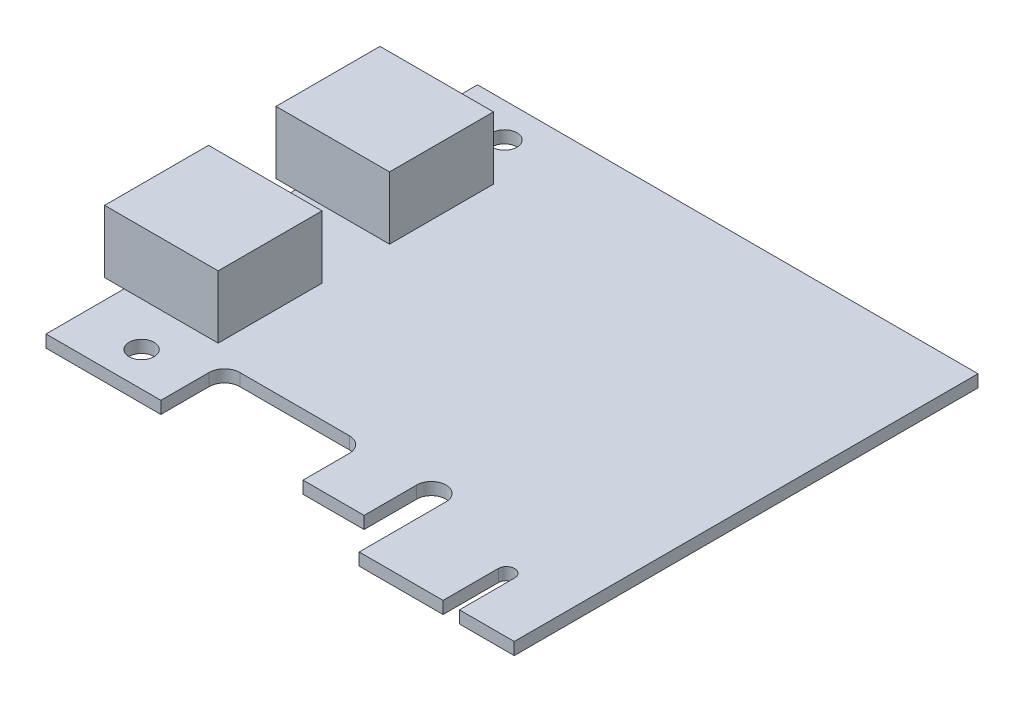
ISO-10303-21;
HEADER;
FILE_DESCRIPTION(('STEP AP214'),'2;1');
FILE_NAME('part.step','',(''),(''),'','','');
FILE_SCHEMA(('AUTOMOTIVE_DESIGN { 1 0 10303 214 1 1 1 1 }'));
ENDSEC;
DATA;
#1=APPLICATION_CONTEXT('core data for automotive mechanical design processes');
#2=APPLICATION_PROTOCOL_DEFINITION('international standard','automotive_design',2000,#1);
#3=PRODUCT_CONTEXT('',#1,'mechanical');
#4=PRODUCT('Part','Part','',(#3));
#5=PRODUCT_RELATED_PRODUCT_CATEGORY('part','',(#4));
#6=PRODUCT_DEFINITION_FORMATION('','',#4);
#7=PRODUCT_DEFINITION_CONTEXT('part definition',#1,'design');
#8=PRODUCT_DEFINITION('design','',#6,#7);
#9=PRODUCT_DEFINITION_SHAPE('','',#8);
#10=(LENGTH_UNIT() NAMED_UNIT(*) SI_UNIT(.MILLI.,.METRE.));
#11=(NAMED_UNIT(*) PLANE_ANGLE_UNIT() SI_UNIT($,.RADIAN.));
#12=(NAMED_UNIT(*) SI_UNIT($,.STERADIAN.) SOLID_ANGLE_UNIT());
#13=UNCERTAINTY_MEASURE_WITH_UNIT(LENGTH_MEASURE(1.E-05),#10,'distance_accuracy_value','');
#14=(GEOMETRIC_REPRESENTATION_CONTEXT(3) GLOBAL_UNCERTAINTY_ASSIGNED_CONTEXT((#13)) GLOBAL_UNIT_ASSIGNED_CONTEXT((#10,
#11,#12)) REPRESENTATION_CONTEXT('',''));
#15=CARTESIAN_POINT('',(0.,0.,0.));
#16=DIRECTION('',(0.,0.,1.));
#17=DIRECTION('',(1.,0.,0.));
#18=AXIS2_PLACEMENT_3D('',#15,#16,#17);
#19=CARTESIAN_POINT('',(-15.6276,1.6,19.7292));
#20=DIRECTION('',(0.,1.,0.));
#21=DIRECTION('',(0.,0.,1.));
#22=AXIS2_PLACEMENT_3D('',#19,#20,#21);
#23=PLANE('',#22);
#24=CARTESIAN_POINT('',(-24.6126,1.6,-25.7302));
#25=DIRECTION('',(0.,1.,0.));
#26=DIRECTION('',(0.,0.,1.));
#27=AXIS2_PLACEMENT_3D('',#24,#25,#26);
#28=CIRCLE('',#27,1.63195);
#29=CARTESIAN_POINT('',(-24.6126,1.6,-24.09825));
#30=VERTEX_POINT('',#29);
#31=EDGE_CURVE('E281',#30,#30,#28,.T.);
#32=ORIENTED_EDGE('',*,*,#31,.F.);
#33=EDGE_LOOP('',(#32));
#34=FACE_BOUND('',#33,.T.);
#35=CARTESIAN_POINT('',(-24.6126,1.6,21.5392));
#36=DIRECTION('',(0.,1.,0.));
#37=DIRECTION('',(0.,0.,1.));
#38=AXIS2_PLACEMENT_3D('',#35,#36,#37);
#39=CIRCLE('',#38,1.63195);
#40=CARTESIAN_POINT('',(-24.6126,1.6,23.17115));
#41=VERTEX_POINT('',#40);
#42=EDGE_CURVE('E287',#41,#41,#39,.T.);
#43=ORIENTED_EDGE('',*,*,#42,.F.);
#44=EDGE_LOOP('',(#43));
#45=FACE_BOUND('',#44,.T.);
#46=DIRECTION('',(0.,0.,1.));
#47=VECTOR('',#46,1.);
#48=CARTESIAN_POINT('',(-32.5882,1.6,26.0096));
#49=LINE('',#48,#47);
#50=CARTESIAN_POINT('',(-32.5882,1.6,-6.48969999999998));
#51=VERTEX_POINT('',#50);
#52=CARTESIAN_POINT('',(-32.5882,1.6,2.29870000000001));
#53=VERTEX_POINT('',#52);
#54=EDGE_CURVE('E448',#51,#53,#49,.T.);
#55=ORIENTED_EDGE('',*,*,#54,.T.);
#56=DIRECTION('',(-1.,0.,0.));
#57=VECTOR('',#56,1.);
#58=CARTESIAN_POINT('',(-35.1282,1.6,2.29870000000001));
#59=LINE('',#58,#57);
#60=CARTESIAN_POINT('',(-20.3454,1.6,2.29870000000001));
#61=VERTEX_POINT('',#60);
#62=EDGE_CURVE('E776',#61,#53,#59,.T.);
#63=ORIENTED_EDGE('',*,*,#62,.F.);
#64=DIRECTION('',(0.,0.,-1.));
#65=VECTOR('',#64,1.);
#66=CARTESIAN_POINT('',(-20.3454,1.6,15.8369));
#67=LINE('',#66,#65);
#68=CARTESIAN_POINT('',(-20.3454,1.6,15.8369));
#69=VERTEX_POINT('',#68);
#70=EDGE_CURVE('E243',#69,#61,#67,.T.);
#71=ORIENTED_EDGE('',*,*,#70,.F.);
#72=DIRECTION('',(-1.,0.,0.));
#73=VECTOR('',#72,1.);
#74=CARTESIAN_POINT('',(-15.6276,1.6,15.8369));
#75=LINE('',#74,#73);
#76=CARTESIAN_POINT('',(-32.5882,1.6,15.8369));
#77=VERTEX_POINT('',#76);
#78=EDGE_CURVE('E11',#69,#77,#75,.T.);
#79=ORIENTED_EDGE('',*,*,#78,.T.);
#80=CARTESIAN_POINT('',(-32.5882,1.6,26.0096));
#81=VERTEX_POINT('',#80);
#82=EDGE_CURVE('E300',#77,#81,#49,.T.);
#83=ORIENTED_EDGE('',*,*,#82,.T.);
#84=DIRECTION('',(1.,0.,0.));
#85=VECTOR('',#84,1.);
#86=CARTESIAN_POINT('',(-17.6276,1.6,26.0096));
#87=LINE('',#86,#85);
#88=CARTESIAN_POINT('',(-17.6276,1.6,26.0096));
#89=VERTEX_POINT('',#88);
#90=EDGE_CURVE('E303',#81,#89,#87,.T.);
#91=ORIENTED_EDGE('',*,*,#90,.T.);
#92=DIRECTION('',(0.,0.,-1.));
#93=VECTOR('',#92,1.);
#94=CARTESIAN_POINT('',(-17.6276,1.6,19.7292));
#95=LINE('',#94,#93);
#96=CARTESIAN_POINT('',(-17.6276,1.6,19.7292));
#97=VERTEX_POINT('',#96);
#98=EDGE_CURVE('E306',#89,#97,#95,.T.);
#99=ORIENTED_EDGE('',*,*,#98,.T.);
#100=CARTESIAN_POINT('',(-15.6276,1.6,19.7292));
#101=DIRECTION('',(0.,-1.,0.));
#102=DIRECTION('',(0.,0.,1.));
#103=AXIS2_PLACEMENT_3D('',#100,#101,#102);
#104=CIRCLE('',#103,2.);
#105=CARTESIAN_POINT('',(-15.6276,1.6,17.7292));
#106=VERTEX_POINT('',#105);
#107=EDGE_CURVE('E308',#97,#106,#104,.T.);
#108=ORIENTED_EDGE('',*,*,#107,.T.);
#109=DIRECTION('',(1.,0.,0.));
#110=VECTOR('',#109,1.);
#111=CARTESIAN_POINT('',(-1.365,1.6,17.7292));
#112=LINE('',#111,#110);
#113=CARTESIAN_POINT('',(-1.365,1.6,17.7292));
#114=VERTEX_POINT('',#113);
#115=EDGE_CURVE('E310',#106,#114,#112,.T.);
#116=ORIENTED_EDGE('',*,*,#115,.T.);
#117=CARTESIAN_POINT('',(-1.365,1.6,19.7292));
#118=DIRECTION('',(0.,-1.,0.));
#119=DIRECTION('',(0.,0.,-1.));
#120=AXIS2_PLACEMENT_3D('',#117,#118,#119);
#121=CIRCLE('',#120,2.);
#122=CARTESIAN_POINT('',(0.634999999999999,1.6,19.7292));
#123=VERTEX_POINT('',#122);
#124=EDGE_CURVE('E312',#114,#123,#121,.T.);
#125=ORIENTED_EDGE('',*,*,#124,.T.);
#126=DIRECTION('',(0.,0.,1.));
#127=VECTOR('',#126,1.);
#128=CARTESIAN_POINT('',(0.635,1.6,25.7556));
#129=LINE('',#128,#127);
#130=CARTESIAN_POINT('',(0.635,1.6,25.7556));
#131=VERTEX_POINT('',#130);
#132=EDGE_CURVE('E314',#123,#131,#129,.T.);
#133=ORIENTED_EDGE('',*,*,#132,.T.);
#134=DIRECTION('',(1.,0.,0.));
#135=VECTOR('',#134,1.);
#136=CARTESIAN_POINT('',(8.5852,1.6,25.7556));
#137=LINE('',#136,#135);
#138=CARTESIAN_POINT('',(8.5852,1.6,25.7556));
#139=VERTEX_POINT('',#138);
#140=EDGE_CURVE('E316',#131,#139,#137,.T.);
#141=ORIENTED_EDGE('',*,*,#140,.T.);
#142=DIRECTION('',(0.,0.,-1.));
#143=VECTOR('',#142,1.);
#144=CARTESIAN_POINT('',(8.5852,1.6,18.8976));
#145=LINE('',#144,#143);
#146=CARTESIAN_POINT('',(8.5852,1.6,18.8976));
#147=VERTEX_POINT('',#146);
#148=EDGE_CURVE('E318',#139,#147,#145,.T.);
#149=ORIENTED_EDGE('',*,*,#148,.T.);
#150=CARTESIAN_POINT('',(10.4902,1.6,18.8976));
#151=DIRECTION('',(0.,-1.,0.));
#152=DIRECTION('',(0.,0.,1.));
#153=AXIS2_PLACEMENT_3D('',#150,#151,#152);
#154=CIRCLE('',#153,1.905);
#155=CARTESIAN_POINT('',(12.3952,1.6,18.8976));
#156=VERTEX_POINT('',#155);
#157=EDGE_CURVE('E320',#147,#156,#154,.T.);
#158=ORIENTED_EDGE('',*,*,#157,.T.);
#159=DIRECTION('',(0.,0.,1.));
#160=VECTOR('',#159,1.);
#161=CARTESIAN_POINT('',(12.3952,1.6,30.2006));
#162=LINE('',#161,#160);
#163=CARTESIAN_POINT('',(12.3952,1.6,30.2006));
#164=VERTEX_POINT('',#163);
#165=EDGE_CURVE('E322',#156,#164,#162,.T.);
#166=ORIENTED_EDGE('',*,*,#165,.T.);
#167=DIRECTION('',(1.,0.,0.));
#168=VECTOR('',#167,1.);
#169=CARTESIAN_POINT('',(12.3952,1.6,30.2006));
#170=LINE('',#169,#168);
#171=CARTESIAN_POINT('',(23.3172,1.6,30.2006));
#172=VERTEX_POINT('',#171);
#173=EDGE_CURVE('E324',#164,#172,#170,.T.);
#174=ORIENTED_EDGE('',*,*,#173,.T.);
#175=DIRECTION('',(0.,0.,-1.));
#176=VECTOR('',#175,1.);
#177=CARTESIAN_POINT('',(23.3172,1.6,30.2006));
#178=LINE('',#177,#176);
#179=CARTESIAN_POINT('',(23.3172,1.6,23.0124));
#180=VERTEX_POINT('',#179);
#181=EDGE_CURVE('E326',#172,#180,#178,.T.);
#182=ORIENTED_EDGE('',*,*,#181,.T.);
#183=CARTESIAN_POINT('',(24.384,1.6,23.0124));
#184=DIRECTION('',(0.,-1.,0.));
#185=DIRECTION('',(0.,0.,-1.));
#186=AXIS2_PLACEMENT_3D('',#183,#184,#185);
#187=CIRCLE('',#186,1.0668);
#188=CARTESIAN_POINT('',(25.4508,1.6,23.0124));
#189=VERTEX_POINT('',#188);
#190=EDGE_CURVE('E328',#180,#189,#187,.T.);
#191=ORIENTED_EDGE('',*,*,#190,.T.);
#192=DIRECTION('',(0.,0.,1.));
#193=VECTOR('',#192,1.);
#194=CARTESIAN_POINT('',(25.4508,1.6,23.0124));
#195=LINE('',#194,#193);
#196=CARTESIAN_POINT('',(25.4508,1.6,30.2006));
#197=VERTEX_POINT('',#196);
#198=EDGE_CURVE('E330',#189,#197,#195,.T.);
#199=ORIENTED_EDGE('',*,*,#198,.T.);
#200=DIRECTION('',(1.,0.,0.));
#201=VECTOR('',#200,1.);
#202=CARTESIAN_POINT('',(25.4508,1.6,30.2006));
#203=LINE('',#202,#201);
#204=CARTESIAN_POINT('',(32.5882,1.6,30.2006));
#205=VERTEX_POINT('',#204);
#206=EDGE_CURVE('E332',#197,#205,#203,.T.);
#207=ORIENTED_EDGE('',*,*,#206,.T.);
#208=DIRECTION('',(0.,0.,-1.));
#209=VECTOR('',#208,1.);
#210=CARTESIAN_POINT('',(32.5882,1.6,30.2006));
#211=LINE('',#210,#209);
#212=CARTESIAN_POINT('',(32.5882,1.6,-30.2006));
#213=VERTEX_POINT('',#212);
#214=EDGE_CURVE('E294',#205,#213,#211,.T.);
#215=ORIENTED_EDGE('',*,*,#214,.T.);
#216=DIRECTION('',(-1.,0.,0.));
#217=VECTOR('',#216,1.);
#218=CARTESIAN_POINT('',(-32.5882,1.6,-30.2006));
#219=LINE('',#218,#217);
#220=CARTESIAN_POINT('',(-32.5882,1.6,-30.2006));
#221=VERTEX_POINT('',#220);
#222=EDGE_CURVE('E297',#213,#221,#219,.T.);
#223=ORIENTED_EDGE('',*,*,#222,.T.);
#224=CARTESIAN_POINT('',(-32.5882,1.6,-20.0279));
#225=VERTEX_POINT('',#224);
#226=EDGE_CURVE('E301',#221,#225,#49,.T.);
#227=ORIENTED_EDGE('',*,*,#226,.T.);
#228=DIRECTION('',(-1.,0.,0.));
#229=VECTOR('',#228,1.);
#230=CARTESIAN_POINT('',(-35.1282,1.6,-20.0279));
#231=LINE('',#230,#229);
#232=CARTESIAN_POINT('',(-20.3454,1.6,-20.0279));
#233=VERTEX_POINT('',#232);
#234=EDGE_CURVE('E263',#233,#225,#231,.T.);
#235=ORIENTED_EDGE('',*,*,#234,.F.);
#236=DIRECTION('',(0.,0.,-1.));
#237=VECTOR('',#236,1.);
#238=CARTESIAN_POINT('',(-20.3454,1.6,-6.48969999999999));
#239=LINE('',#238,#237);
#240=CARTESIAN_POINT('',(-20.3454,1.6,-6.48969999999999));
#241=VERTEX_POINT('',#240);
#242=EDGE_CURVE('E57',#241,#233,#239,.T.);
#243=ORIENTED_EDGE('',*,*,#242,.F.);
#244=DIRECTION('',(1.,0.,0.));
#245=VECTOR('',#244,1.);
#246=CARTESIAN_POINT('',(-35.1282,1.6,-6.48969999999999));
#247=LINE('',#246,#245);
#248=EDGE_CURVE('E42',#51,#241,#247,.T.);
#249=ORIENTED_EDGE('',*,*,#248,.F.);
#250=EDGE_LOOP('',(#55,#63,#71,#79,#83,#91,#99,#108,#116,#125,#133,#141,#149,#158,#166,#174,
#182,#191,#199,#207,#215,#223,#227,#235,#243,#249));
#251=FACE_BOUND('',#250,.T.);
#252=ADVANCED_FACE('F34',(#34,#45,#251),#23,.T.);
#253=CARTESIAN_POINT('',(32.5882,1.6,30.2006));
#254=DIRECTION('',(-1.,0.,0.));
#255=DIRECTION('',(0.,0.,1.));
#256=AXIS2_PLACEMENT_3D('',#253,#254,#255);
#257=PLANE('',#256);
#258=DIRECTION('',(0.,0.,-1.));
#259=VECTOR('',#258,1.);
#260=CARTESIAN_POINT('',(32.5882,0.,30.2006));
#261=LINE('',#260,#259);
#262=CARTESIAN_POINT('',(32.5882,0.,30.2006));
#263=VERTEX_POINT('',#262);
#264=CARTESIAN_POINT('',(32.5882,0.,-30.2006));
#265=VERTEX_POINT('',#264);
#266=EDGE_CURVE('E293',#263,#265,#261,.T.);
#267=ORIENTED_EDGE('',*,*,#266,.T.);
#268=DIRECTION('',(0.,-1.,0.));
#269=VECTOR('',#268,1.);
#270=CARTESIAN_POINT('',(32.5882,1.6,-30.2006));
#271=LINE('',#270,#269);
#272=EDGE_CURVE('E419',#213,#265,#271,.T.);
#273=ORIENTED_EDGE('',*,*,#272,.F.);
#274=ORIENTED_EDGE('',*,*,#214,.F.);
#275=DIRECTION('',(0.,-1.,0.));
#276=VECTOR('',#275,1.);
#277=CARTESIAN_POINT('',(32.5882,1.6,30.2006));
#278=LINE('',#277,#276);
#279=EDGE_CURVE('E334',#205,#263,#278,.T.);
#280=ORIENTED_EDGE('',*,*,#279,.T.);
#281=EDGE_LOOP('',(#267,#273,#274,#280));
#282=FACE_BOUND('',#281,.T.);
#283=ADVANCED_FACE('F36',(#282),#257,.F.);
#284=CARTESIAN_POINT('',(-32.5882,1.6,-30.2006));
#285=DIRECTION('',(0.,0.,1.));
#286=DIRECTION('',(1.,0.,0.));
#287=AXIS2_PLACEMENT_3D('',#284,#285,#286);
#288=PLANE('',#287);
#289=DIRECTION('',(-1.,0.,0.));
#290=VECTOR('',#289,1.);
#291=CARTESIAN_POINT('',(-32.5882,0.,-30.2006));
#292=LINE('',#291,#290);
#293=CARTESIAN_POINT('',(-32.5882,0.,-30.2006));
#294=VERTEX_POINT('',#293);
#295=EDGE_CURVE('E337',#265,#294,#292,.T.);
#296=ORIENTED_EDGE('',*,*,#295,.T.);
#297=DIRECTION('',(0.,-1.,0.));
#298=VECTOR('',#297,1.);
#299=CARTESIAN_POINT('',(-32.5882,1.6,-30.2006));
#300=LINE('',#299,#298);
#301=EDGE_CURVE('E417',#221,#294,#300,.T.);
#302=ORIENTED_EDGE('',*,*,#301,.F.);
#303=ORIENTED_EDGE('',*,*,#222,.F.);
#304=ORIENTED_EDGE('',*,*,#272,.T.);
#305=EDGE_LOOP('',(#296,#302,#303,#304));
#306=FACE_BOUND('',#305,.T.);
#307=ADVANCED_FACE('F537',(#306),#288,.F.);
#308=CARTESIAN_POINT('',(-32.5882,1.6,26.0096));
#309=DIRECTION('',(1.,0.,0.));
#310=DIRECTION('',(0.,0.,-1.));
#311=AXIS2_PLACEMENT_3D('',#308,#309,#310);
#312=PLANE('',#311);
#313=DIRECTION('',(0.,0.,1.));
#314=VECTOR('',#313,1.);
#315=CARTESIAN_POINT('',(-32.5882,0.,26.0096));
#316=LINE('',#315,#314);
#317=CARTESIAN_POINT('',(-32.5882,0.,26.0096));
#318=VERTEX_POINT('',#317);
#319=EDGE_CURVE('E339',#294,#318,#316,.T.);
#320=ORIENTED_EDGE('',*,*,#319,.T.);
#321=DIRECTION('',(0.,-1.,0.));
#322=VECTOR('',#321,1.);
#323=CARTESIAN_POINT('',(-32.5882,1.6,26.0096));
#324=LINE('',#323,#322);
#325=EDGE_CURVE('E414',#81,#318,#324,.T.);
#326=ORIENTED_EDGE('',*,*,#325,.F.);
#327=ORIENTED_EDGE('',*,*,#82,.F.);
#328=EDGE_CURVE('E449',#53,#77,#49,.T.);
#329=ORIENTED_EDGE('',*,*,#328,.F.);
#330=ORIENTED_EDGE('',*,*,#54,.F.);
#331=EDGE_CURVE('E304',#225,#51,#49,.T.);
#332=ORIENTED_EDGE('',*,*,#331,.F.);
#333=ORIENTED_EDGE('',*,*,#226,.F.);
#334=ORIENTED_EDGE('',*,*,#301,.T.);
#335=EDGE_LOOP('',(#320,#326,#327,#329,#330,#332,#333,#334));
#336=FACE_BOUND('',#335,.T.);
#337=ADVANCED_FACE('F456',(#336),#312,.F.);
#338=CARTESIAN_POINT('',(-17.6276,1.6,26.0096));
#339=DIRECTION('',(0.,0.,-1.));
#340=DIRECTION('',(-1.,0.,0.));
#341=AXIS2_PLACEMENT_3D('',#338,#339,#340);
#342=PLANE('',#341);
#343=DIRECTION('',(1.,0.,0.));
#344=VECTOR('',#343,1.);
#345=CARTESIAN_POINT('',(-17.6276,0.,26.0096));
#346=LINE('',#345,#344);
#347=CARTESIAN_POINT('',(-17.6276,0.,26.0096));
#348=VERTEX_POINT('',#347);
#349=EDGE_CURVE('E341',#318,#348,#346,.T.);
#350=ORIENTED_EDGE('',*,*,#349,.T.);
#351=DIRECTION('',(0.,-1.,0.));
#352=VECTOR('',#351,1.);
#353=CARTESIAN_POINT('',(-17.6276,1.6,26.0096));
#354=LINE('',#353,#352);
#355=EDGE_CURVE('E411',#89,#348,#354,.T.);
#356=ORIENTED_EDGE('',*,*,#355,.F.);
#357=ORIENTED_EDGE('',*,*,#90,.F.);
#358=ORIENTED_EDGE('',*,*,#325,.T.);
#359=EDGE_LOOP('',(#350,#356,#357,#358));
#360=FACE_BOUND('',#359,.T.);
#361=ADVANCED_FACE('F460',(#360),#342,.F.);
#362=CARTESIAN_POINT('',(-17.6276,1.6,19.7292));
#363=DIRECTION('',(-1.,0.,0.));
#364=DIRECTION('',(0.,0.,1.));
#365=AXIS2_PLACEMENT_3D('',#362,#363,#364);
#366=PLANE('',#365);
#367=DIRECTION('',(0.,0.,-1.));
#368=VECTOR('',#367,1.);
#369=CARTESIAN_POINT('',(-17.6276,0.,19.7292));
#370=LINE('',#369,#368);
#371=CARTESIAN_POINT('',(-17.6276,0.,19.7292));
#372=VERTEX_POINT('',#371);
#373=EDGE_CURVE('E343',#348,#372,#370,.T.);
#374=ORIENTED_EDGE('',*,*,#373,.T.);
#375=DIRECTION('',(0.,-1.,0.));
#376=VECTOR('',#375,1.);
#377=CARTESIAN_POINT('',(-17.6276,1.6,19.7292));
#378=LINE('',#377,#376);
#379=EDGE_CURVE('E408',#97,#372,#378,.T.);
#380=ORIENTED_EDGE('',*,*,#379,.F.);
#381=ORIENTED_EDGE('',*,*,#98,.F.);
#382=ORIENTED_EDGE('',*,*,#355,.T.);
#383=EDGE_LOOP('',(#374,#380,#381,#382));
#384=FACE_BOUND('',#383,.T.);
#385=ADVANCED_FACE('F465',(#384),#366,.F.);
#386=CARTESIAN_POINT('',(-15.6276,1.6,19.7292));
#387=DIRECTION('',(0.,-1.,0.));
#388=DIRECTION('',(0.,0.,-1.));
#389=AXIS2_PLACEMENT_3D('',#386,#387,#388);
#390=CYLINDRICAL_SURFACE('',#389,2.);
#391=CARTESIAN_POINT('',(-15.6276,0.,19.7292));
#392=DIRECTION('',(0.,-1.,0.));
#393=DIRECTION('',(0.,0.,1.));
#394=AXIS2_PLACEMENT_3D('',#391,#392,#393);
#395=CIRCLE('',#394,2.);
#396=CARTESIAN_POINT('',(-15.6276,0.,17.7292));
#397=VERTEX_POINT('',#396);
#398=EDGE_CURVE('E345',#372,#397,#395,.T.);
#399=ORIENTED_EDGE('',*,*,#398,.T.);
#400=DIRECTION('',(0.,-1.,0.));
#401=VECTOR('',#400,1.);
#402=CARTESIAN_POINT('',(-15.6276,1.6,17.7292));
#403=LINE('',#402,#401);
#404=EDGE_CURVE('E405',#106,#397,#403,.T.);
#405=ORIENTED_EDGE('',*,*,#404,.F.);
#406=ORIENTED_EDGE('',*,*,#107,.F.);
#407=ORIENTED_EDGE('',*,*,#379,.T.);
#408=EDGE_LOOP('',(#399,#405,#406,#407));
#409=FACE_BOUND('',#408,.T.);
#410=ADVANCED_FACE('F471',(#409),#390,.F.);
#411=CARTESIAN_POINT('',(-1.365,1.6,17.7292));
#412=DIRECTION('',(0.,0.,-1.));
#413=DIRECTION('',(-1.,0.,0.));
#414=AXIS2_PLACEMENT_3D('',#411,#412,#413);
#415=PLANE('',#414);
#416=DIRECTION('',(1.,0.,0.));
#417=VECTOR('',#416,1.);
#418=CARTESIAN_POINT('',(-1.365,0.,17.7292));
#419=LINE('',#418,#417);
#420=CARTESIAN_POINT('',(-1.365,0.,17.7292));
#421=VERTEX_POINT('',#420);
#422=EDGE_CURVE('E347',#397,#421,#419,.T.);
#423=ORIENTED_EDGE('',*,*,#422,.T.);
#424=DIRECTION('',(0.,-1.,0.));
#425=VECTOR('',#424,1.);
#426=CARTESIAN_POINT('',(-1.365,1.6,17.7292));
#427=LINE('',#426,#425);
#428=EDGE_CURVE('E402',#114,#421,#427,.T.);
#429=ORIENTED_EDGE('',*,*,#428,.F.);
#430=ORIENTED_EDGE('',*,*,#115,.F.);
#431=ORIENTED_EDGE('',*,*,#404,.T.);
#432=EDGE_LOOP('',(#423,#429,#430,#431));
#433=FACE_BOUND('',#432,.T.);
#434=ADVANCED_FACE('F475',(#433),#415,.F.);
#435=CARTESIAN_POINT('',(-1.365,1.6,19.7292));
#436=DIRECTION('',(0.,-1.,0.));
#437=DIRECTION('',(0.,0.,-1.));
#438=AXIS2_PLACEMENT_3D('',#435,#436,#437);
#439=CYLINDRICAL_SURFACE('',#438,2.);
#440=CARTESIAN_POINT('',(-1.365,0.,19.7292));
#441=DIRECTION('',(0.,-1.,0.));
#442=DIRECTION('',(0.,0.,-1.));
#443=AXIS2_PLACEMENT_3D('',#440,#441,#442);
#444=CIRCLE('',#443,2.);
#445=CARTESIAN_POINT('',(0.634999999999999,0.,19.7292));
#446=VERTEX_POINT('',#445);
#447=EDGE_CURVE('E349',#421,#446,#444,.T.);
#448=ORIENTED_EDGE('',*,*,#447,.T.);
#449=DIRECTION('',(0.,-1.,0.));
#450=VECTOR('',#449,1.);
#451=CARTESIAN_POINT('',(0.634999999999999,1.6,19.7292));
#452=LINE('',#451,#450);
#453=EDGE_CURVE('E399',#123,#446,#452,.T.);
#454=ORIENTED_EDGE('',*,*,#453,.F.);
#455=ORIENTED_EDGE('',*,*,#124,.F.);
#456=ORIENTED_EDGE('',*,*,#428,.T.);
#457=EDGE_LOOP('',(#448,#454,#455,#456));
#458=FACE_BOUND('',#457,.T.);
#459=ADVANCED_FACE('F480',(#458),#439,.F.);
#460=CARTESIAN_POINT('',(0.635,1.6,25.7556));
#461=DIRECTION('',(1.,0.,0.));
#462=DIRECTION('',(0.,0.,-1.));
#463=AXIS2_PLACEMENT_3D('',#460,#461,#462);
#464=PLANE('',#463);
#465=DIRECTION('',(0.,0.,1.));
#466=VECTOR('',#465,1.);
#467=CARTESIAN_POINT('',(0.635,0.,25.7556));
#468=LINE('',#467,#466);
#469=CARTESIAN_POINT('',(0.635,0.,25.7556));
#470=VERTEX_POINT('',#469);
#471=EDGE_CURVE('E351',#446,#470,#468,.T.);
#472=ORIENTED_EDGE('',*,*,#471,.T.);
#473=DIRECTION('',(0.,-1.,0.));
#474=VECTOR('',#473,1.);
#475=CARTESIAN_POINT('',(0.635,1.6,25.7556));
#476=LINE('',#475,#474);
#477=EDGE_CURVE('E396',#131,#470,#476,.T.);
#478=ORIENTED_EDGE('',*,*,#477,.F.);
#479=ORIENTED_EDGE('',*,*,#132,.F.);
#480=ORIENTED_EDGE('',*,*,#453,.T.);
#481=EDGE_LOOP('',(#472,#478,#479,#480));
#482=FACE_BOUND('',#481,.T.);
#483=ADVANCED_FACE('F486',(#482),#464,.F.);
#484=CARTESIAN_POINT('',(8.5852,1.6,25.7556));
#485=DIRECTION('',(0.,0.,-1.));
#486=DIRECTION('',(-1.,0.,0.));
#487=AXIS2_PLACEMENT_3D('',#484,#485,#486);
#488=PLANE('',#487);
#489=DIRECTION('',(1.,0.,0.));
#490=VECTOR('',#489,1.);
#491=CARTESIAN_POINT('',(8.5852,0.,25.7556));
#492=LINE('',#491,#490);
#493=CARTESIAN_POINT('',(8.5852,0.,25.7556));
#494=VERTEX_POINT('',#493);
#495=EDGE_CURVE('E353',#470,#494,#492,.T.);
#496=ORIENTED_EDGE('',*,*,#495,.T.);
#497=DIRECTION('',(0.,-1.,0.));
#498=VECTOR('',#497,1.);
#499=CARTESIAN_POINT('',(8.5852,1.6,25.7556));
#500=LINE('',#499,#498);
#501=EDGE_CURVE('E393',#139,#494,#500,.T.);
#502=ORIENTED_EDGE('',*,*,#501,.F.);
#503=ORIENTED_EDGE('',*,*,#140,.F.);
#504=ORIENTED_EDGE('',*,*,#477,.T.);
#505=EDGE_LOOP('',(#496,#502,#503,#504));
#506=FACE_BOUND('',#505,.T.);
#507=ADVANCED_FACE('F490',(#506),#488,.F.);
#508=CARTESIAN_POINT('',(8.5852,1.6,18.8976));
#509=DIRECTION('',(-1.,0.,0.));
#510=DIRECTION('',(0.,0.,1.));
#511=AXIS2_PLACEMENT_3D('',#508,#509,#510);
#512=PLANE('',#511);
#513=DIRECTION('',(0.,0.,-1.));
#514=VECTOR('',#513,1.);
#515=CARTESIAN_POINT('',(8.5852,0.,18.8976));
#516=LINE('',#515,#514);
#517=CARTESIAN_POINT('',(8.5852,0.,18.8976));
#518=VERTEX_POINT('',#517);
#519=EDGE_CURVE('E355',#494,#518,#516,.T.);
#520=ORIENTED_EDGE('',*,*,#519,.T.);
#521=DIRECTION('',(0.,-1.,0.));
#522=VECTOR('',#521,1.);
#523=CARTESIAN_POINT('',(8.5852,1.6,18.8976));
#524=LINE('',#523,#522);
#525=EDGE_CURVE('E390',#147,#518,#524,.T.);
#526=ORIENTED_EDGE('',*,*,#525,.F.);
#527=ORIENTED_EDGE('',*,*,#148,.F.);
#528=ORIENTED_EDGE('',*,*,#501,.T.);
#529=EDGE_LOOP('',(#520,#526,#527,#528));
#530=FACE_BOUND('',#529,.T.);
#531=ADVANCED_FACE('F495',(#530),#512,.F.);
#532=CARTESIAN_POINT('',(10.4902,1.6,18.8976));
#533=DIRECTION('',(0.,-1.,0.));
#534=DIRECTION('',(0.,0.,-1.));
#535=AXIS2_PLACEMENT_3D('',#532,#533,#534);
#536=CYLINDRICAL_SURFACE('',#535,1.905);
#537=CARTESIAN_POINT('',(10.4902,0.,18.8976));
#538=DIRECTION('',(0.,-1.,0.));
#539=DIRECTION('',(0.,0.,1.));
#540=AXIS2_PLACEMENT_3D('',#537,#538,#539);
#541=CIRCLE('',#540,1.905);
#542=CARTESIAN_POINT('',(12.3952,0.,18.8976));
#543=VERTEX_POINT('',#542);
#544=EDGE_CURVE('E357',#518,#543,#541,.T.);
#545=ORIENTED_EDGE('',*,*,#544,.T.);
#546=DIRECTION('',(0.,-1.,0.));
#547=VECTOR('',#546,1.);
#548=CARTESIAN_POINT('',(12.3952,1.6,18.8976));
#549=LINE('',#548,#547);
#550=EDGE_CURVE('E387',#156,#543,#549,.T.);
#551=ORIENTED_EDGE('',*,*,#550,.F.);
#552=ORIENTED_EDGE('',*,*,#157,.F.);
#553=ORIENTED_EDGE('',*,*,#525,.T.);
#554=EDGE_LOOP('',(#545,#551,#552,#553));
#555=FACE_BOUND('',#554,.T.);
#556=ADVANCED_FACE('F501',(#555),#536,.F.);
#557=CARTESIAN_POINT('',(12.3952,1.6,30.2006));
#558=DIRECTION('',(1.,0.,0.));
#559=DIRECTION('',(0.,0.,-1.));
#560=AXIS2_PLACEMENT_3D('',#557,#558,#559);
#561=PLANE('',#560);
#562=DIRECTION('',(0.,0.,1.));
#563=VECTOR('',#562,1.);
#564=CARTESIAN_POINT('',(12.3952,0.,30.2006));
#565=LINE('',#564,#563);
#566=CARTESIAN_POINT('',(12.3952,0.,30.2006));
#567=VERTEX_POINT('',#566);
#568=EDGE_CURVE('E359',#543,#567,#565,.T.);
#569=ORIENTED_EDGE('',*,*,#568,.T.);
#570=DIRECTION('',(0.,-1.,0.));
#571=VECTOR('',#570,1.);
#572=CARTESIAN_POINT('',(12.3952,1.6,30.2006));
#573=LINE('',#572,#571);
#574=EDGE_CURVE('E384',#164,#567,#573,.T.);
#575=ORIENTED_EDGE('',*,*,#574,.F.);
#576=ORIENTED_EDGE('',*,*,#165,.F.);
#577=ORIENTED_EDGE('',*,*,#550,.T.);
#578=EDGE_LOOP('',(#569,#575,#576,#577));
#579=FACE_BOUND('',#578,.T.);
#580=ADVANCED_FACE('F505',(#579),#561,.F.);
#581=CARTESIAN_POINT('',(12.3952,1.6,30.2006));
#582=DIRECTION('',(0.,0.,-1.));
#583=DIRECTION('',(-1.,0.,0.));
#584=AXIS2_PLACEMENT_3D('',#581,#582,#583);
#585=PLANE('',#584);
#586=DIRECTION('',(1.,0.,0.));
#587=VECTOR('',#586,1.);
#588=CARTESIAN_POINT('',(12.3952,0.,30.2006));
#589=LINE('',#588,#587);
#590=CARTESIAN_POINT('',(23.3172,0.,30.2006));
#591=VERTEX_POINT('',#590);
#592=EDGE_CURVE('E361',#567,#591,#589,.T.);
#593=ORIENTED_EDGE('',*,*,#592,.T.);
#594=DIRECTION('',(0.,-1.,0.));
#595=VECTOR('',#594,1.);
#596=CARTESIAN_POINT('',(23.3172,1.6,30.2006));
#597=LINE('',#596,#595);
#598=EDGE_CURVE('E381',#172,#591,#597,.T.);
#599=ORIENTED_EDGE('',*,*,#598,.F.);
#600=ORIENTED_EDGE('',*,*,#173,.F.);
#601=ORIENTED_EDGE('',*,*,#574,.T.);
#602=EDGE_LOOP('',(#593,#599,#600,#601));
#603=FACE_BOUND('',#602,.T.);
#604=ADVANCED_FACE('F510',(#603),#585,.F.);
#605=CARTESIAN_POINT('',(23.3172,1.6,30.2006));
#606=DIRECTION('',(-1.,0.,0.));
#607=DIRECTION('',(0.,0.,1.));
#608=AXIS2_PLACEMENT_3D('',#605,#606,#607);
#609=PLANE('',#608);
#610=DIRECTION('',(0.,0.,-1.));
#611=VECTOR('',#610,1.);
#612=CARTESIAN_POINT('',(23.3172,0.,30.2006));
#613=LINE('',#612,#611);
#614=CARTESIAN_POINT('',(23.3172,0.,23.0124));
#615=VERTEX_POINT('',#614);
#616=EDGE_CURVE('E363',#591,#615,#613,.T.);
#617=ORIENTED_EDGE('',*,*,#616,.T.);
#618=DIRECTION('',(0.,-1.,0.));
#619=VECTOR('',#618,1.);
#620=CARTESIAN_POINT('',(23.3172,1.6,23.0124));
#621=LINE('',#620,#619);
#622=EDGE_CURVE('E378',#180,#615,#621,.T.);
#623=ORIENTED_EDGE('',*,*,#622,.F.);
#624=ORIENTED_EDGE('',*,*,#181,.F.);
#625=ORIENTED_EDGE('',*,*,#598,.T.);
#626=EDGE_LOOP('',(#617,#623,#624,#625));
#627=FACE_BOUND('',#626,.T.);
#628=ADVANCED_FACE('F516',(#627),#609,.F.);
#629=CARTESIAN_POINT('',(24.384,1.6,23.0124));
#630=DIRECTION('',(0.,-1.,0.));
#631=DIRECTION('',(0.,0.,-1.));
#632=AXIS2_PLACEMENT_3D('',#629,#630,#631);
#633=CYLINDRICAL_SURFACE('',#632,1.0668);
#634=CARTESIAN_POINT('',(24.384,0.,23.0124));
#635=DIRECTION('',(0.,-1.,0.));
#636=DIRECTION('',(0.,0.,-1.));
#637=AXIS2_PLACEMENT_3D('',#634,#635,#636);
#638=CIRCLE('',#637,1.0668);
#639=CARTESIAN_POINT('',(25.4508,0.,23.0124));
#640=VERTEX_POINT('',#639);
#641=EDGE_CURVE('E365',#615,#640,#638,.T.);
#642=ORIENTED_EDGE('',*,*,#641,.T.);
#643=DIRECTION('',(0.,-1.,0.));
#644=VECTOR('',#643,1.);
#645=CARTESIAN_POINT('',(25.4508,1.6,23.0124));
#646=LINE('',#645,#644);
#647=EDGE_CURVE('E375',#189,#640,#646,.T.);
#648=ORIENTED_EDGE('',*,*,#647,.F.);
#649=ORIENTED_EDGE('',*,*,#190,.F.);
#650=ORIENTED_EDGE('',*,*,#622,.T.);
#651=EDGE_LOOP('',(#642,#648,#649,#650));
#652=FACE_BOUND('',#651,.T.);
#653=ADVANCED_FACE('F520',(#652),#633,.F.);
#654=CARTESIAN_POINT('',(25.4508,1.6,23.0124));
#655=DIRECTION('',(1.,0.,0.));
#656=DIRECTION('',(0.,0.,-1.));
#657=AXIS2_PLACEMENT_3D('',#654,#655,#656);
#658=PLANE('',#657);
#659=DIRECTION('',(0.,0.,1.));
#660=VECTOR('',#659,1.);
#661=CARTESIAN_POINT('',(25.4508,0.,23.0124));
#662=LINE('',#661,#660);
#663=CARTESIAN_POINT('',(25.4508,0.,30.2006));
#664=VERTEX_POINT('',#663);
#665=EDGE_CURVE('E367',#640,#664,#662,.T.);
#666=ORIENTED_EDGE('',*,*,#665,.T.);
#667=DIRECTION('',(0.,-1.,0.));
#668=VECTOR('',#667,1.);
#669=CARTESIAN_POINT('',(25.4508,1.6,30.2006));
#670=LINE('',#669,#668);
#671=EDGE_CURVE('E372',#197,#664,#670,.T.);
#672=ORIENTED_EDGE('',*,*,#671,.F.);
#673=ORIENTED_EDGE('',*,*,#198,.F.);
#674=ORIENTED_EDGE('',*,*,#647,.T.);
#675=EDGE_LOOP('',(#666,#672,#673,#674));
#676=FACE_BOUND('',#675,.T.);
#677=ADVANCED_FACE('F525',(#676),#658,.F.);
#678=CARTESIAN_POINT('',(25.4508,1.6,30.2006));
#679=DIRECTION('',(0.,0.,-1.));
#680=DIRECTION('',(-1.,0.,0.));
#681=AXIS2_PLACEMENT_3D('',#678,#679,#680);
#682=PLANE('',#681);
#683=DIRECTION('',(1.,0.,0.));
#684=VECTOR('',#683,1.);
#685=CARTESIAN_POINT('',(25.4508,0.,30.2006));
#686=LINE('',#685,#684);
#687=EDGE_CURVE('E298',#664,#263,#686,.T.);
#688=ORIENTED_EDGE('',*,*,#687,.T.);
#689=ORIENTED_EDGE('',*,*,#279,.F.);
#690=ORIENTED_EDGE('',*,*,#206,.F.);
#691=ORIENTED_EDGE('',*,*,#671,.T.);
#692=EDGE_LOOP('',(#688,#689,#690,#691));
#693=FACE_BOUND('',#692,.T.);
#694=ADVANCED_FACE('F530',(#693),#682,.F.);
#695=CARTESIAN_POINT('',(-15.6276,0.,19.7292));
#696=DIRECTION('',(0.,1.,0.));
#697=DIRECTION('',(0.,0.,1.));
#698=AXIS2_PLACEMENT_3D('',#695,#696,#697);
#699=PLANE('',#698);
#700=CARTESIAN_POINT('',(-24.6126,0.,-25.7302));
#701=DIRECTION('',(0.,1.,0.));
#702=DIRECTION('',(0.,0.,1.));
#703=AXIS2_PLACEMENT_3D('',#700,#701,#702);
#704=CIRCLE('',#703,1.63195);
#705=CARTESIAN_POINT('',(-24.6126,0.,-24.09825));
#706=VERTEX_POINT('',#705);
#707=EDGE_CURVE('E284',#706,#706,#704,.T.);
#708=ORIENTED_EDGE('',*,*,#707,.T.);
#709=EDGE_LOOP('',(#708));
#710=FACE_BOUND('',#709,.T.);
#711=CARTESIAN_POINT('',(-24.6126,0.,21.5392));
#712=DIRECTION('',(0.,1.,0.));
#713=DIRECTION('',(0.,0.,1.));
#714=AXIS2_PLACEMENT_3D('',#711,#712,#713);
#715=CIRCLE('',#714,1.63195);
#716=CARTESIAN_POINT('',(-24.6126,0.,23.17115));
#717=VERTEX_POINT('',#716);
#718=EDGE_CURVE('E290',#717,#717,#715,.T.);
#719=ORIENTED_EDGE('',*,*,#718,.T.);
#720=EDGE_LOOP('',(#719));
#721=FACE_BOUND('',#720,.T.);
#722=ORIENTED_EDGE('',*,*,#266,.F.);
#723=ORIENTED_EDGE('',*,*,#687,.F.);
#724=ORIENTED_EDGE('',*,*,#665,.F.);
#725=ORIENTED_EDGE('',*,*,#641,.F.);
#726=ORIENTED_EDGE('',*,*,#616,.F.);
#727=ORIENTED_EDGE('',*,*,#592,.F.);
#728=ORIENTED_EDGE('',*,*,#568,.F.);
#729=ORIENTED_EDGE('',*,*,#544,.F.);
#730=ORIENTED_EDGE('',*,*,#519,.F.);
#731=ORIENTED_EDGE('',*,*,#495,.F.);
#732=ORIENTED_EDGE('',*,*,#471,.F.);
#733=ORIENTED_EDGE('',*,*,#447,.F.);
#734=ORIENTED_EDGE('',*,*,#422,.F.);
#735=ORIENTED_EDGE('',*,*,#398,.F.);
#736=ORIENTED_EDGE('',*,*,#373,.F.);
#737=ORIENTED_EDGE('',*,*,#349,.F.);
#738=ORIENTED_EDGE('',*,*,#319,.F.);
#739=ORIENTED_EDGE('',*,*,#295,.F.);
#740=EDGE_LOOP('',(#722,#723,#724,#725,#726,#727,#728,#729,#730,#731,#732,#733,#734,#735,#736,
#737,#738,#739));
#741=FACE_BOUND('',#740,.T.);
#742=ADVANCED_FACE('F535',(#710,#721,#741),#699,.F.);
#743=CARTESIAN_POINT('',(-24.6126,1.6,21.5392));
#744=DIRECTION('',(0.,1.,0.));
#745=DIRECTION('',(0.,0.,1.));
#746=AXIS2_PLACEMENT_3D('',#743,#744,#745);
#747=CYLINDRICAL_SURFACE('',#746,1.63195);
#748=ORIENTED_EDGE('',*,*,#718,.F.);
#749=EDGE_LOOP('',(#748));
#750=FACE_BOUND('',#749,.T.);
#751=ORIENTED_EDGE('',*,*,#42,.T.);
#752=EDGE_LOOP('',(#751));
#753=FACE_BOUND('',#752,.T.);
#754=ADVANCED_FACE('F559',(#750,#753),#747,.F.);
#755=CARTESIAN_POINT('',(-24.6126,1.6,-25.7302));
#756=DIRECTION('',(0.,1.,0.));
#757=DIRECTION('',(0.,0.,1.));
#758=AXIS2_PLACEMENT_3D('',#755,#756,#757);
#759=CYLINDRICAL_SURFACE('',#758,1.63195);
#760=ORIENTED_EDGE('',*,*,#707,.F.);
#761=EDGE_LOOP('',(#760));
#762=FACE_BOUND('',#761,.T.);
#763=ORIENTED_EDGE('',*,*,#31,.T.);
#764=EDGE_LOOP('',(#763));
#765=FACE_BOUND('',#764,.T.);
#766=ADVANCED_FACE('F675',(#762,#765),#759,.F.);
#767=CARTESIAN_POINT('',(-20.3454,9.7534,-6.48969999999999));
#768=DIRECTION('',(-1.,0.,0.));
#769=DIRECTION('',(0.,0.,1.));
#770=AXIS2_PLACEMENT_3D('',#767,#768,#769);
#771=PLANE('',#770);
#772=ORIENTED_EDGE('',*,*,#242,.T.);
#773=DIRECTION('',(0.,-1.,0.));
#774=VECTOR('',#773,1.);
#775=CARTESIAN_POINT('',(-20.3454,9.7534,-20.0279));
#776=LINE('',#775,#774);
#777=CARTESIAN_POINT('',(-20.3454,9.7534,-20.0279));
#778=VERTEX_POINT('',#777);
#779=EDGE_CURVE('E278',#778,#233,#776,.T.);
#780=ORIENTED_EDGE('',*,*,#779,.F.);
#781=DIRECTION('',(0.,0.,-1.));
#782=VECTOR('',#781,1.);
#783=CARTESIAN_POINT('',(-20.3454,9.7534,-6.48969999999999));
#784=LINE('',#783,#782);
#785=CARTESIAN_POINT('',(-20.3454,9.7534,-6.48969999999999));
#786=VERTEX_POINT('',#785);
#787=EDGE_CURVE('E252',#786,#778,#784,.T.);
#788=ORIENTED_EDGE('',*,*,#787,.F.);
#789=DIRECTION('',(0.,-1.,0.));
#790=VECTOR('',#789,1.);
#791=CARTESIAN_POINT('',(-20.3454,9.7534,-6.48969999999999));
#792=LINE('',#791,#790);
#793=EDGE_CURVE('E261',#786,#241,#792,.T.);
#794=ORIENTED_EDGE('',*,*,#793,.T.);
#795=EDGE_LOOP('',(#772,#780,#788,#794));
#796=FACE_BOUND('',#795,.T.);
#797=ADVANCED_FACE('F432',(#796),#771,.F.);
#798=CARTESIAN_POINT('',(-35.1282,9.7534,-20.0279));
#799=DIRECTION('',(0.,0.,1.));
#800=DIRECTION('',(1.,0.,0.));
#801=AXIS2_PLACEMENT_3D('',#798,#799,#800);
#802=PLANE('',#801);
#803=ORIENTED_EDGE('',*,*,#234,.T.);
#804=CARTESIAN_POINT('',(-35.1282,1.6,-20.0279));
#805=VERTEX_POINT('',#804);
#806=EDGE_CURVE('E246',#225,#805,#231,.T.);
#807=ORIENTED_EDGE('',*,*,#806,.T.);
#808=DIRECTION('',(0.,-1.,0.));
#809=VECTOR('',#808,1.);
#810=CARTESIAN_POINT('',(-35.1282,9.7534,-20.0279));
#811=LINE('',#810,#809);
#812=CARTESIAN_POINT('',(-35.1282,9.7534,-20.0279));
#813=VERTEX_POINT('',#812);
#814=EDGE_CURVE('E275',#813,#805,#811,.T.);
#815=ORIENTED_EDGE('',*,*,#814,.F.);
#816=DIRECTION('',(-1.,0.,0.));
#817=VECTOR('',#816,1.);
#818=CARTESIAN_POINT('',(-35.1282,9.7534,-20.0279));
#819=LINE('',#818,#817);
#820=EDGE_CURVE('E255',#778,#813,#819,.T.);
#821=ORIENTED_EDGE('',*,*,#820,.F.);
#822=ORIENTED_EDGE('',*,*,#779,.T.);
#823=EDGE_LOOP('',(#803,#807,#815,#821,#822));
#824=FACE_BOUND('',#823,.T.);
#825=ADVANCED_FACE('F539',(#824),#802,.F.);
#826=CARTESIAN_POINT('',(-35.1282,9.7534,-6.48969999999999));
#827=DIRECTION('',(1.,0.,0.));
#828=DIRECTION('',(0.,0.,-1.));
#829=AXIS2_PLACEMENT_3D('',#826,#827,#828);
#830=PLANE('',#829);
#831=DIRECTION('',(0.,0.,1.));
#832=VECTOR('',#831,1.);
#833=CARTESIAN_POINT('',(-35.1282,1.6,-6.48969999999999));
#834=LINE('',#833,#832);
#835=CARTESIAN_POINT('',(-35.1282,1.6,-6.48969999999999));
#836=VERTEX_POINT('',#835);
#837=EDGE_CURVE('E266',#805,#836,#834,.T.);
#838=ORIENTED_EDGE('',*,*,#837,.T.);
#839=DIRECTION('',(0.,-1.,0.));
#840=VECTOR('',#839,1.);
#841=CARTESIAN_POINT('',(-35.1282,9.7534,-6.48969999999999));
#842=LINE('',#841,#840);
#843=CARTESIAN_POINT('',(-35.1282,9.7534,-6.48969999999999));
#844=VERTEX_POINT('',#843);
#845=EDGE_CURVE('E272',#844,#836,#842,.T.);
#846=ORIENTED_EDGE('',*,*,#845,.F.);
#847=DIRECTION('',(0.,0.,1.));
#848=VECTOR('',#847,1.);
#849=CARTESIAN_POINT('',(-35.1282,9.7534,-6.48969999999999));
#850=LINE('',#849,#848);
#851=EDGE_CURVE('E258',#813,#844,#850,.T.);
#852=ORIENTED_EDGE('',*,*,#851,.F.);
#853=ORIENTED_EDGE('',*,*,#814,.T.);
#854=EDGE_LOOP('',(#838,#846,#852,#853));
#855=FACE_BOUND('',#854,.T.);
#856=ADVANCED_FACE('F540',(#855),#830,.F.);
#857=CARTESIAN_POINT('',(-35.1282,9.7534,-6.48969999999999));
#858=DIRECTION('',(0.,0.,-1.));
#859=DIRECTION('',(-1.,0.,0.));
#860=AXIS2_PLACEMENT_3D('',#857,#858,#859);
#861=PLANE('',#860);
#862=EDGE_CURVE('E256',#836,#51,#247,.T.);
#863=ORIENTED_EDGE('',*,*,#862,.T.);
#864=ORIENTED_EDGE('',*,*,#248,.T.);
#865=ORIENTED_EDGE('',*,*,#793,.F.);
#866=DIRECTION('',(1.,0.,0.));
#867=VECTOR('',#866,1.);
#868=CARTESIAN_POINT('',(-35.1282,9.7534,-6.48969999999999));
#869=LINE('',#868,#867);
#870=EDGE_CURVE('E260',#844,#786,#869,.T.);
#871=ORIENTED_EDGE('',*,*,#870,.F.);
#872=ORIENTED_EDGE('',*,*,#845,.T.);
#873=EDGE_LOOP('',(#863,#864,#865,#871,#872));
#874=FACE_BOUND('',#873,.T.);
#875=ADVANCED_FACE('F425',(#874),#861,.F.);
#876=CARTESIAN_POINT('',(0.,9.7534,0.));
#877=DIRECTION('',(0.,-1.,0.));
#878=DIRECTION('',(0.,0.,-1.));
#879=AXIS2_PLACEMENT_3D('',#876,#877,#878);
#880=PLANE('',#879);
#881=ORIENTED_EDGE('',*,*,#787,.T.);
#882=ORIENTED_EDGE('',*,*,#820,.T.);
#883=ORIENTED_EDGE('',*,*,#851,.T.);
#884=ORIENTED_EDGE('',*,*,#870,.T.);
#885=EDGE_LOOP('',(#881,#882,#883,#884));
#886=FACE_BOUND('',#885,.T.);
#887=ADVANCED_FACE('F435',(#886),#880,.F.);
#888=CARTESIAN_POINT('',(0.,1.6,0.));
#889=DIRECTION('',(0.,-1.,0.));
#890=DIRECTION('',(0.,0.,-1.));
#891=AXIS2_PLACEMENT_3D('',#888,#889,#890);
#892=PLANE('',#891);
#893=ORIENTED_EDGE('',*,*,#806,.F.);
#894=ORIENTED_EDGE('',*,*,#331,.T.);
#895=ORIENTED_EDGE('',*,*,#862,.F.);
#896=ORIENTED_EDGE('',*,*,#837,.F.);
#897=EDGE_LOOP('',(#893,#894,#895,#896));
#898=FACE_BOUND('',#897,.T.);
#899=ADVANCED_FACE('F444',(#898),#892,.T.);
#900=CARTESIAN_POINT('',(0.,1.6,0.));
#901=DIRECTION('',(0.,-1.,0.));
#902=DIRECTION('',(0.,0.,-1.));
#903=AXIS2_PLACEMENT_3D('',#900,#901,#902);
#904=PLANE('',#903);
#905=ORIENTED_EDGE('',*,*,#328,.T.);
#906=DIRECTION('',(1.,0.,0.));
#907=VECTOR('',#906,1.);
#908=CARTESIAN_POINT('',(-35.1282,1.6,15.8369));
#909=LINE('',#908,#907);
#910=CARTESIAN_POINT('',(-35.1282,1.6,15.8369));
#911=VERTEX_POINT('',#910);
#912=EDGE_CURVE('E49',#911,#77,#909,.T.);
#913=ORIENTED_EDGE('',*,*,#912,.F.);
#914=DIRECTION('',(0.,0.,1.));
#915=VECTOR('',#914,1.);
#916=CARTESIAN_POINT('',(-35.1282,1.6,15.8369));
#917=LINE('',#916,#915);
#918=CARTESIAN_POINT('',(-35.1282,1.6,2.29870000000001));
#919=VERTEX_POINT('',#918);
#920=EDGE_CURVE('E775',#919,#911,#917,.T.);
#921=ORIENTED_EDGE('',*,*,#920,.F.);
#922=EDGE_CURVE('E785',#53,#919,#59,.T.);
#923=ORIENTED_EDGE('',*,*,#922,.F.);
#924=EDGE_LOOP('',(#905,#913,#921,#923));
#925=FACE_BOUND('',#924,.T.);
#926=ADVANCED_FACE('F718',(#925),#904,.T.);
#927=CARTESIAN_POINT('',(-20.3454,9.7534,15.8369));
#928=DIRECTION('',(-1.,0.,0.));
#929=DIRECTION('',(0.,0.,1.));
#930=AXIS2_PLACEMENT_3D('',#927,#928,#929);
#931=PLANE('',#930);
#932=ORIENTED_EDGE('',*,*,#70,.T.);
#933=DIRECTION('',(0.,-1.,0.));
#934=VECTOR('',#933,1.);
#935=CARTESIAN_POINT('',(-20.3454,9.7534,2.29870000000001));
#936=LINE('',#935,#934);
#937=CARTESIAN_POINT('',(-20.3454,9.7534,2.29870000000001));
#938=VERTEX_POINT('',#937);
#939=EDGE_CURVE('E224',#938,#61,#936,.T.);
#940=ORIENTED_EDGE('',*,*,#939,.F.);
#941=DIRECTION('',(0.,0.,-1.));
#942=VECTOR('',#941,1.);
#943=CARTESIAN_POINT('',(-20.3454,9.7534,15.8369));
#944=LINE('',#943,#942);
#945=CARTESIAN_POINT('',(-20.3454,9.7534,15.8369));
#946=VERTEX_POINT('',#945);
#947=EDGE_CURVE('E231',#946,#938,#944,.T.);
#948=ORIENTED_EDGE('',*,*,#947,.F.);
#949=DIRECTION('',(0.,-1.,0.));
#950=VECTOR('',#949,1.);
#951=CARTESIAN_POINT('',(-20.3454,9.7534,15.8369));
#952=LINE('',#951,#950);
#953=EDGE_CURVE('E778',#946,#69,#952,.T.);
#954=ORIENTED_EDGE('',*,*,#953,.T.);
#955=EDGE_LOOP('',(#932,#940,#948,#954));
#956=FACE_BOUND('',#955,.T.);
#957=ADVANCED_FACE('F241',(#956),#931,.F.);
#958=CARTESIAN_POINT('',(-35.1282,9.7534,2.29870000000001));
#959=DIRECTION('',(0.,0.,1.));
#960=DIRECTION('',(1.,0.,0.));
#961=AXIS2_PLACEMENT_3D('',#958,#959,#960);
#962=PLANE('',#961);
#963=ORIENTED_EDGE('',*,*,#62,.T.);
#964=ORIENTED_EDGE('',*,*,#922,.T.);
#965=DIRECTION('',(0.,-1.,0.));
#966=VECTOR('',#965,1.);
#967=CARTESIAN_POINT('',(-35.1282,9.7534,2.29870000000001));
#968=LINE('',#967,#966);
#969=CARTESIAN_POINT('',(-35.1282,9.7534,2.29870000000001));
#970=VERTEX_POINT('',#969);
#971=EDGE_CURVE('E227',#970,#919,#968,.T.);
#972=ORIENTED_EDGE('',*,*,#971,.F.);
#973=DIRECTION('',(-1.,0.,0.));
#974=VECTOR('',#973,1.);
#975=CARTESIAN_POINT('',(-35.1282,9.7534,2.29870000000001));
#976=LINE('',#975,#974);
#977=EDGE_CURVE('E219',#938,#970,#976,.T.);
#978=ORIENTED_EDGE('',*,*,#977,.F.);
#979=ORIENTED_EDGE('',*,*,#939,.T.);
#980=EDGE_LOOP('',(#963,#964,#972,#978,#979));
#981=FACE_BOUND('',#980,.T.);
#982=ADVANCED_FACE('F222',(#981),#962,.F.);
#983=CARTESIAN_POINT('',(-35.1282,9.7534,15.8369));
#984=DIRECTION('',(1.,0.,0.));
#985=DIRECTION('',(0.,0.,-1.));
#986=AXIS2_PLACEMENT_3D('',#983,#984,#985);
#987=PLANE('',#986);
#988=ORIENTED_EDGE('',*,*,#920,.T.);
#989=DIRECTION('',(0.,-1.,0.));
#990=VECTOR('',#989,1.);
#991=CARTESIAN_POINT('',(-35.1282,9.7534,15.8369));
#992=LINE('',#991,#990);
#993=CARTESIAN_POINT('',(-35.1282,9.7534,15.8369));
#994=VERTEX_POINT('',#993);
#995=EDGE_CURVE('E248',#994,#911,#992,.T.);
#996=ORIENTED_EDGE('',*,*,#995,.F.);
#997=DIRECTION('',(0.,0.,1.));
#998=VECTOR('',#997,1.);
#999=CARTESIAN_POINT('',(-35.1282,9.7534,15.8369));
#1000=LINE('',#999,#998);
#1001=EDGE_CURVE('E230',#970,#994,#1000,.T.);
#1002=ORIENTED_EDGE('',*,*,#1001,.F.);
#1003=ORIENTED_EDGE('',*,*,#971,.T.);
#1004=EDGE_LOOP('',(#988,#996,#1002,#1003));
#1005=FACE_BOUND('',#1004,.T.);
#1006=ADVANCED_FACE('F743',(#1005),#987,.F.);
#1007=CARTESIAN_POINT('',(-35.1282,9.7534,15.8369));
#1008=DIRECTION('',(0.,0.,-1.));
#1009=DIRECTION('',(-1.,0.,0.));
#1010=AXIS2_PLACEMENT_3D('',#1007,#1008,#1009);
#1011=PLANE('',#1010);
#1012=ORIENTED_EDGE('',*,*,#912,.T.);
#1013=ORIENTED_EDGE('',*,*,#78,.F.);
#1014=ORIENTED_EDGE('',*,*,#953,.F.);
#1015=DIRECTION('',(1.,0.,0.));
#1016=VECTOR('',#1015,1.);
#1017=CARTESIAN_POINT('',(-35.1282,9.7534,15.8369));
#1018=LINE('',#1017,#1016);
#1019=EDGE_CURVE('E236',#994,#946,#1018,.T.);
#1020=ORIENTED_EDGE('',*,*,#1019,.F.);
#1021=ORIENTED_EDGE('',*,*,#995,.T.);
#1022=EDGE_LOOP('',(#1012,#1013,#1014,#1020,#1021));
#1023=FACE_BOUND('',#1022,.T.);
#1024=ADVANCED_FACE('F752',(#1023),#1011,.F.);
#1025=CARTESIAN_POINT('',(0.,9.7534,0.));
#1026=DIRECTION('',(0.,-1.,0.));
#1027=DIRECTION('',(0.,0.,-1.));
#1028=AXIS2_PLACEMENT_3D('',#1025,#1026,#1027);
#1029=PLANE('',#1028);
#1030=ORIENTED_EDGE('',*,*,#947,.T.);
#1031=ORIENTED_EDGE('',*,*,#977,.T.);
#1032=ORIENTED_EDGE('',*,*,#1001,.T.);
#1033=ORIENTED_EDGE('',*,*,#1019,.T.);
#1034=EDGE_LOOP('',(#1030,#1031,#1032,#1033));
#1035=FACE_BOUND('',#1034,.T.);
#1036=ADVANCED_FACE('F234',(#1035),#1029,.F.);
#1037=CLOSED_SHELL('',(#252,#283,#307,#337,#361,#385,#410,#434,#459,#483,#507,#531,#556,#580,
#604,#628,#653,#677,#694,#742,#754,#766,#797,#825,#856,#875,#887,#899,#926,#957,#982,#1006,
#1024,#1036));
#1038=MANIFOLD_SOLID_BREP('B2',#1037);
#1039=ADVANCED_BREP_SHAPE_REPRESENTATION('',(#18,#1038),#14);
#1040=SHAPE_DEFINITION_REPRESENTATION(#9,#1039);
ENDSEC;
END-ISO-10303-21;
